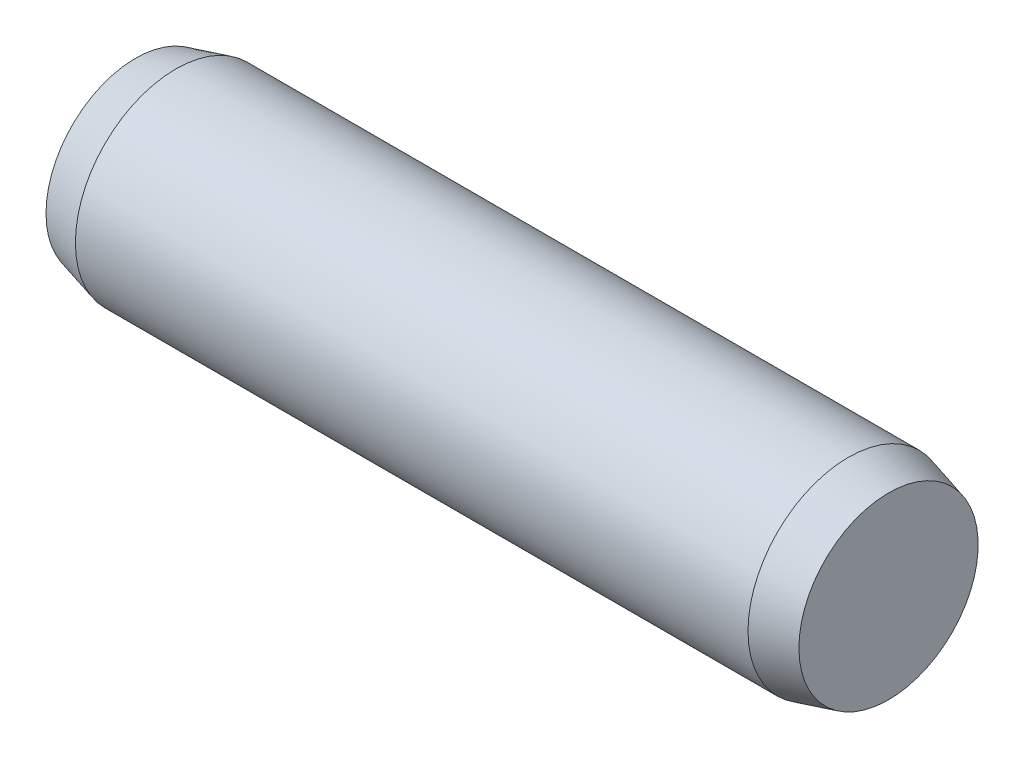
ISO-10303-21;
HEADER;
FILE_DESCRIPTION(('STEP AP214'),'2;1');
FILE_NAME('part.step','',(''),(''),'','','');
FILE_SCHEMA(('AUTOMOTIVE_DESIGN { 1 0 10303 214 1 1 1 1 }'));
ENDSEC;
DATA;
#1=APPLICATION_CONTEXT('core data for automotive mechanical design processes');
#2=APPLICATION_PROTOCOL_DEFINITION('international standard','automotive_design',2000,#1);
#3=PRODUCT_CONTEXT('',#1,'mechanical');
#4=PRODUCT('Part','Part','',(#3));
#5=PRODUCT_RELATED_PRODUCT_CATEGORY('part','',(#4));
#6=PRODUCT_DEFINITION_FORMATION('','',#4);
#7=PRODUCT_DEFINITION_CONTEXT('part definition',#1,'design');
#8=PRODUCT_DEFINITION('design','',#6,#7);
#9=PRODUCT_DEFINITION_SHAPE('','',#8);
#10=(LENGTH_UNIT() NAMED_UNIT(*) SI_UNIT(.MILLI.,.METRE.));
#11=(NAMED_UNIT(*) PLANE_ANGLE_UNIT() SI_UNIT($,.RADIAN.));
#12=(NAMED_UNIT(*) SI_UNIT($,.STERADIAN.) SOLID_ANGLE_UNIT());
#13=UNCERTAINTY_MEASURE_WITH_UNIT(LENGTH_MEASURE(1.E-05),#10,'distance_accuracy_value','');
#14=(GEOMETRIC_REPRESENTATION_CONTEXT(3) GLOBAL_UNCERTAINTY_ASSIGNED_CONTEXT((#13)) GLOBAL_UNIT_ASSIGNED_CONTEXT((#10,
#11,#12)) REPRESENTATION_CONTEXT('',''));
#15=CARTESIAN_POINT('',(0.,0.,0.));
#16=DIRECTION('',(0.,0.,1.));
#17=DIRECTION('',(1.,0.,0.));
#18=AXIS2_PLACEMENT_3D('',#15,#16,#17);
#19=CARTESIAN_POINT('',(0.,3.5712812921102,0.));
#20=DIRECTION('',(1.,0.,0.));
#21=DIRECTION('',(0.,0.,-1.));
#22=AXIS2_PLACEMENT_3D('',#19,#20,#21);
#23=PLANE('',#22);
#24=CARTESIAN_POINT('',(0.,0.,0.));
#25=DIRECTION('',(-1.,0.,0.));
#26=DIRECTION('',(0.,0.,1.));
#27=AXIS2_PLACEMENT_3D('',#24,#25,#26);
#28=CIRCLE('',#27,3.5712812921102);
#29=CARTESIAN_POINT('',(0.,0.,3.5712812921102));
#30=VERTEX_POINT('',#29);
#31=EDGE_CURVE('E10',#30,#30,#28,.T.);
#32=ORIENTED_EDGE('',*,*,#31,.T.);
#33=EDGE_LOOP('',(#32));
#34=FACE_BOUND('',#33,.T.);
#35=ADVANCED_FACE('F37',(#34),#23,.F.);
#36=CARTESIAN_POINT('',(1.6,0.,0.));
#37=DIRECTION('',(1.,0.,0.));
#38=DIRECTION('',(0.,0.,-1.));
#39=AXIS2_PLACEMENT_3D('',#36,#37,#38);
#40=CONICAL_SURFACE('',#39,4.,0.26179938779915);
#41=ORIENTED_EDGE('',*,*,#31,.F.);
#42=EDGE_LOOP('',(#41));
#43=FACE_BOUND('',#42,.T.);
#44=CARTESIAN_POINT('',(1.6,0.,0.));
#45=DIRECTION('',(-1.,0.,0.));
#46=DIRECTION('',(0.,0.,1.));
#47=AXIS2_PLACEMENT_3D('',#44,#45,#46);
#48=CIRCLE('',#47,4.);
#49=CARTESIAN_POINT('',(1.6,0.,4.));
#50=VERTEX_POINT('',#49);
#51=EDGE_CURVE('E43',#50,#50,#48,.T.);
#52=ORIENTED_EDGE('',*,*,#51,.T.);
#53=EDGE_LOOP('',(#52));
#54=FACE_BOUND('',#53,.T.);
#55=ADVANCED_FACE('F69',(#43,#54),#40,.T.);
#56=CARTESIAN_POINT('',(-6.97668367754887,0.,0.));
#57=DIRECTION('',(-1.,0.,0.));
#58=DIRECTION('',(0.,0.,1.));
#59=AXIS2_PLACEMENT_3D('',#56,#57,#58);
#60=CYLINDRICAL_SURFACE('',#59,4.);
#61=ORIENTED_EDGE('',*,*,#51,.F.);
#62=EDGE_LOOP('',(#61));
#63=FACE_BOUND('',#62,.T.);
#64=CARTESIAN_POINT('',(28.4,0.,0.));
#65=DIRECTION('',(-1.,0.,0.));
#66=DIRECTION('',(0.,0.,1.));
#67=AXIS2_PLACEMENT_3D('',#64,#65,#66);
#68=CIRCLE('',#67,4.);
#69=CARTESIAN_POINT('',(28.4,0.,4.));
#70=VERTEX_POINT('',#69);
#71=EDGE_CURVE('E47',#70,#70,#68,.T.);
#72=ORIENTED_EDGE('',*,*,#71,.T.);
#73=EDGE_LOOP('',(#72));
#74=FACE_BOUND('',#73,.T.);
#75=ADVANCED_FACE('F65',(#63,#74),#60,.T.);
#76=CARTESIAN_POINT('',(30.,0.,0.));
#77=DIRECTION('',(-1.,0.,0.));
#78=DIRECTION('',(0.,0.,1.));
#79=AXIS2_PLACEMENT_3D('',#76,#77,#78);
#80=CONICAL_SURFACE('',#79,3.5712812921102,0.26179938779915);
#81=ORIENTED_EDGE('',*,*,#71,.F.);
#82=EDGE_LOOP('',(#81));
#83=FACE_BOUND('',#82,.T.);
#84=CARTESIAN_POINT('',(30.,0.,0.));
#85=DIRECTION('',(-1.,0.,0.));
#86=DIRECTION('',(0.,0.,1.));
#87=AXIS2_PLACEMENT_3D('',#84,#85,#86);
#88=CIRCLE('',#87,3.5712812921102);
#89=CARTESIAN_POINT('',(30.,0.,3.5712812921102));
#90=VERTEX_POINT('',#89);
#91=EDGE_CURVE('E51',#90,#90,#88,.T.);
#92=ORIENTED_EDGE('',*,*,#91,.T.);
#93=EDGE_LOOP('',(#92));
#94=FACE_BOUND('',#93,.T.);
#95=ADVANCED_FACE('F57',(#83,#94),#80,.T.);
#96=CARTESIAN_POINT('',(30.,0.,0.));
#97=DIRECTION('',(-1.,0.,0.));
#98=DIRECTION('',(0.,0.,1.));
#99=AXIS2_PLACEMENT_3D('',#96,#97,#98);
#100=PLANE('',#99);
#101=ORIENTED_EDGE('',*,*,#91,.F.);
#102=EDGE_LOOP('',(#101));
#103=FACE_BOUND('',#102,.T.);
#104=ADVANCED_FACE('F59',(#103),#100,.F.);
#105=CLOSED_SHELL('',(#35,#55,#75,#95,#104));
#106=MANIFOLD_SOLID_BREP('B2',#105);
#107=ADVANCED_BREP_SHAPE_REPRESENTATION('',(#18,#106),#14);
#108=SHAPE_DEFINITION_REPRESENTATION(#9,#107);
ENDSEC;
END-ISO-10303-21;
